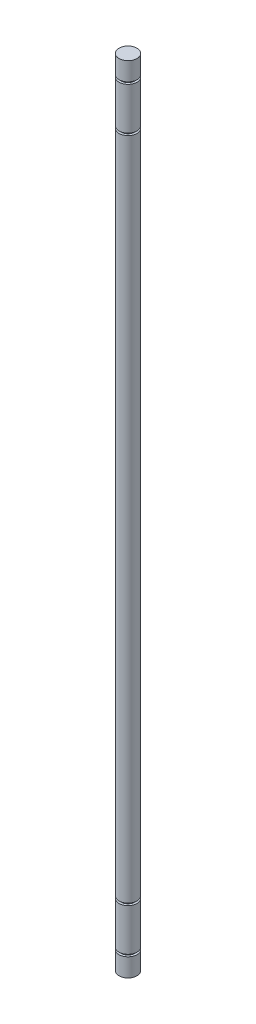
ISO-10303-21;
HEADER;
FILE_DESCRIPTION(('STEP AP214'),'2;1');
FILE_NAME('part.step','',(''),(''),'','','');
FILE_SCHEMA(('AUTOMOTIVE_DESIGN { 1 0 10303 214 1 1 1 1 }'));
ENDSEC;
DATA;
#1=APPLICATION_CONTEXT('core data for automotive mechanical design processes');
#2=APPLICATION_PROTOCOL_DEFINITION('international standard','automotive_design',2000,#1);
#3=PRODUCT_CONTEXT('',#1,'mechanical');
#4=PRODUCT('Part','Part','',(#3));
#5=PRODUCT_RELATED_PRODUCT_CATEGORY('part','',(#4));
#6=PRODUCT_DEFINITION_FORMATION('','',#4);
#7=PRODUCT_DEFINITION_CONTEXT('part definition',#1,'design');
#8=PRODUCT_DEFINITION('design','',#6,#7);
#9=PRODUCT_DEFINITION_SHAPE('','',#8);
#10=(LENGTH_UNIT() NAMED_UNIT(*) SI_UNIT(.MILLI.,.METRE.));
#11=(NAMED_UNIT(*) PLANE_ANGLE_UNIT() SI_UNIT($,.RADIAN.));
#12=(NAMED_UNIT(*) SI_UNIT($,.STERADIAN.) SOLID_ANGLE_UNIT());
#13=UNCERTAINTY_MEASURE_WITH_UNIT(LENGTH_MEASURE(1.E-05),#10,'distance_accuracy_value','');
#14=(GEOMETRIC_REPRESENTATION_CONTEXT(3) GLOBAL_UNCERTAINTY_ASSIGNED_CONTEXT((#13)) GLOBAL_UNIT_ASSIGNED_CONTEXT((#10,
#11,#12)) REPRESENTATION_CONTEXT('',''));
#15=CARTESIAN_POINT('',(0.,0.,0.));
#16=DIRECTION('',(0.,0.,1.));
#17=DIRECTION('',(1.,0.,0.));
#18=AXIS2_PLACEMENT_3D('',#15,#16,#17);
#19=CARTESIAN_POINT('',(0.,70.0659,0.));
#20=DIRECTION('',(0.,-1.,0.));
#21=DIRECTION('',(0.,0.,-1.));
#22=AXIS2_PLACEMENT_3D('',#19,#20,#21);
#23=CYLINDRICAL_SURFACE('',#22,1.5875);
#24=CARTESIAN_POINT('',(0.,-66.8274,0.));
#25=DIRECTION('',(0.,-1.,0.));
#26=DIRECTION('',(0.,0.,-1.));
#27=AXIS2_PLACEMENT_3D('',#24,#25,#26);
#28=CIRCLE('',#27,1.5875);
#29=CARTESIAN_POINT('',(0.,-66.8274,-1.5875));
#30=VERTEX_POINT('',#29);
#31=EDGE_CURVE('E65',#30,#30,#28,.T.);
#32=ORIENTED_EDGE('',*,*,#31,.T.);
#33=EDGE_LOOP('',(#32));
#34=FACE_BOUND('',#33,.T.);
#35=CARTESIAN_POINT('',(0.,-70.0659,0.));
#36=DIRECTION('',(0.,1.,0.));
#37=DIRECTION('',(0.,0.,1.));
#38=AXIS2_PLACEMENT_3D('',#35,#36,#37);
#39=CIRCLE('',#38,1.5875);
#40=CARTESIAN_POINT('',(0.,-70.0659,1.5875));
#41=VERTEX_POINT('',#40);
#42=EDGE_CURVE('E40',#41,#41,#39,.T.);
#43=ORIENTED_EDGE('',*,*,#42,.T.);
#44=EDGE_LOOP('',(#43));
#45=FACE_BOUND('',#44,.T.);
#46=ADVANCED_FACE('F36',(#34,#45),#23,.T.);
#47=CARTESIAN_POINT('',(0.,-70.0659,0.));
#48=DIRECTION('',(0.,1.,0.));
#49=DIRECTION('',(0.,0.,1.));
#50=AXIS2_PLACEMENT_3D('',#47,#48,#49);
#51=PLANE('',#50);
#52=ORIENTED_EDGE('',*,*,#42,.F.);
#53=EDGE_LOOP('',(#52));
#54=FACE_BOUND('',#53,.T.);
#55=ADVANCED_FACE('F144',(#54),#51,.F.);
#56=CARTESIAN_POINT('',(0.,-58.6232,0.));
#57=DIRECTION('',(0.,-1.,0.));
#58=DIRECTION('',(0.,0.,-1.));
#59=AXIS2_PLACEMENT_3D('',#56,#57,#58);
#60=CYLINDRICAL_SURFACE('',#59,1.2065);
#61=CARTESIAN_POINT('',(0.,-66.8274,0.));
#62=DIRECTION('',(0.,-1.,0.));
#63=DIRECTION('',(0.,0.,-1.));
#64=AXIS2_PLACEMENT_3D('',#61,#62,#63);
#65=CIRCLE('',#64,1.2065);
#66=CARTESIAN_POINT('',(0.,-66.8274,-1.2065));
#67=VERTEX_POINT('',#66);
#68=EDGE_CURVE('E61',#67,#67,#65,.T.);
#69=ORIENTED_EDGE('',*,*,#68,.F.);
#70=EDGE_LOOP('',(#69));
#71=FACE_BOUND('',#70,.T.);
#72=CARTESIAN_POINT('',(0.,-66.4464,0.));
#73=DIRECTION('',(0.,-1.,0.));
#74=DIRECTION('',(0.,0.,-1.));
#75=AXIS2_PLACEMENT_3D('',#72,#73,#74);
#76=CIRCLE('',#75,1.2065);
#77=CARTESIAN_POINT('',(0.,-66.4464,-1.2065));
#78=VERTEX_POINT('',#77);
#79=EDGE_CURVE('E71',#78,#78,#76,.T.);
#80=ORIENTED_EDGE('',*,*,#79,.T.);
#81=EDGE_LOOP('',(#80));
#82=FACE_BOUND('',#81,.T.);
#83=ADVANCED_FACE('F149',(#71,#82),#60,.T.);
#84=CARTESIAN_POINT('',(1.2065,-66.8274,0.));
#85=DIRECTION('',(0.,-1.,0.));
#86=DIRECTION('',(0.,0.,-1.));
#87=AXIS2_PLACEMENT_3D('',#84,#85,#86);
#88=PLANE('',#87);
#89=ORIENTED_EDGE('',*,*,#31,.F.);
#90=EDGE_LOOP('',(#89));
#91=FACE_BOUND('',#90,.T.);
#92=ORIENTED_EDGE('',*,*,#68,.T.);
#93=EDGE_LOOP('',(#92));
#94=FACE_BOUND('',#93,.T.);
#95=ADVANCED_FACE('F177',(#91,#94),#88,.F.);
#96=CARTESIAN_POINT('',(1.2065,-66.4464,0.));
#97=DIRECTION('',(0.,1.,0.));
#98=DIRECTION('',(0.,0.,1.));
#99=AXIS2_PLACEMENT_3D('',#96,#97,#98);
#100=PLANE('',#99);
#101=ORIENTED_EDGE('',*,*,#79,.F.);
#102=EDGE_LOOP('',(#101));
#103=FACE_BOUND('',#102,.T.);
#104=CARTESIAN_POINT('',(0.,-66.4464,0.));
#105=DIRECTION('',(0.,-1.,0.));
#106=DIRECTION('',(0.,0.,-1.));
#107=AXIS2_PLACEMENT_3D('',#104,#105,#106);
#108=CIRCLE('',#107,1.5875);
#109=CARTESIAN_POINT('',(0.,-66.4464,-1.5875));
#110=VERTEX_POINT('',#109);
#111=EDGE_CURVE('E68',#110,#110,#108,.T.);
#112=ORIENTED_EDGE('',*,*,#111,.T.);
#113=EDGE_LOOP('',(#112));
#114=FACE_BOUND('',#113,.T.);
#115=ADVANCED_FACE('F141',(#103,#114),#100,.F.);
#116=ORIENTED_EDGE('',*,*,#111,.F.);
#117=EDGE_LOOP('',(#116));
#118=FACE_BOUND('',#117,.T.);
#119=CARTESIAN_POINT('',(0.,-59.0042,0.));
#120=DIRECTION('',(0.,-1.,0.));
#121=DIRECTION('',(0.,0.,-1.));
#122=AXIS2_PLACEMENT_3D('',#119,#120,#121);
#123=CIRCLE('',#122,1.5875);
#124=CARTESIAN_POINT('',(0.,-59.0042,-1.5875));
#125=VERTEX_POINT('',#124);
#126=EDGE_CURVE('E88',#125,#125,#123,.T.);
#127=ORIENTED_EDGE('',*,*,#126,.T.);
#128=EDGE_LOOP('',(#127));
#129=FACE_BOUND('',#128,.T.);
#130=ADVANCED_FACE('F110',(#118,#129),#23,.T.);
#131=CARTESIAN_POINT('',(0.,-58.6232,0.));
#132=DIRECTION('',(0.,-1.,0.));
#133=DIRECTION('',(0.,0.,-1.));
#134=AXIS2_PLACEMENT_3D('',#131,#132,#133);
#135=CYLINDRICAL_SURFACE('',#134,1.2065);
#136=CARTESIAN_POINT('',(0.,-59.0042,0.));
#137=DIRECTION('',(0.,-1.,0.));
#138=DIRECTION('',(0.,0.,-1.));
#139=AXIS2_PLACEMENT_3D('',#136,#137,#138);
#140=CIRCLE('',#139,1.2065);
#141=CARTESIAN_POINT('',(0.,-59.0042,-1.2065));
#142=VERTEX_POINT('',#141);
#143=EDGE_CURVE('E60',#142,#142,#140,.T.);
#144=ORIENTED_EDGE('',*,*,#143,.F.);
#145=EDGE_LOOP('',(#144));
#146=FACE_BOUND('',#145,.T.);
#147=CARTESIAN_POINT('',(0.,-58.6232,0.));
#148=DIRECTION('',(0.,-1.,0.));
#149=DIRECTION('',(0.,0.,-1.));
#150=AXIS2_PLACEMENT_3D('',#147,#148,#149);
#151=CIRCLE('',#150,1.2065);
#152=CARTESIAN_POINT('',(0.,-58.6232,-1.2065));
#153=VERTEX_POINT('',#152);
#154=EDGE_CURVE('E77',#153,#153,#151,.T.);
#155=ORIENTED_EDGE('',*,*,#154,.T.);
#156=EDGE_LOOP('',(#155));
#157=FACE_BOUND('',#156,.T.);
#158=ADVANCED_FACE('F97',(#146,#157),#135,.T.);
#159=CARTESIAN_POINT('',(1.2065,-59.0042,0.));
#160=DIRECTION('',(0.,-1.,0.));
#161=DIRECTION('',(0.,0.,-1.));
#162=AXIS2_PLACEMENT_3D('',#159,#160,#161);
#163=PLANE('',#162);
#164=ORIENTED_EDGE('',*,*,#126,.F.);
#165=EDGE_LOOP('',(#164));
#166=FACE_BOUND('',#165,.T.);
#167=ORIENTED_EDGE('',*,*,#143,.T.);
#168=EDGE_LOOP('',(#167));
#169=FACE_BOUND('',#168,.T.);
#170=ADVANCED_FACE('F103',(#166,#169),#163,.F.);
#171=CARTESIAN_POINT('',(1.2065,-58.6232,0.));
#172=DIRECTION('',(0.,1.,0.));
#173=DIRECTION('',(0.,0.,1.));
#174=AXIS2_PLACEMENT_3D('',#171,#172,#173);
#175=PLANE('',#174);
#176=ORIENTED_EDGE('',*,*,#154,.F.);
#177=EDGE_LOOP('',(#176));
#178=FACE_BOUND('',#177,.T.);
#179=CARTESIAN_POINT('',(0.,-58.6232,0.));
#180=DIRECTION('',(0.,-1.,0.));
#181=DIRECTION('',(0.,0.,-1.));
#182=AXIS2_PLACEMENT_3D('',#179,#180,#181);
#183=CIRCLE('',#182,1.5875);
#184=CARTESIAN_POINT('',(0.,-58.6232,-1.5875));
#185=VERTEX_POINT('',#184);
#186=EDGE_CURVE('E91',#185,#185,#183,.T.);
#187=ORIENTED_EDGE('',*,*,#186,.T.);
#188=EDGE_LOOP('',(#187));
#189=FACE_BOUND('',#188,.T.);
#190=ADVANCED_FACE('F99',(#178,#189),#175,.F.);
#191=ORIENTED_EDGE('',*,*,#186,.F.);
#192=EDGE_LOOP('',(#191));
#193=FACE_BOUND('',#192,.T.);
#194=CARTESIAN_POINT('',(0.,58.6232,0.));
#195=DIRECTION('',(0.,-1.,0.));
#196=DIRECTION('',(0.,0.,-1.));
#197=AXIS2_PLACEMENT_3D('',#194,#195,#196);
#198=CIRCLE('',#197,1.5875);
#199=CARTESIAN_POINT('',(0.,58.6232,-1.5875));
#200=VERTEX_POINT('',#199);
#201=EDGE_CURVE('E51',#200,#200,#198,.T.);
#202=ORIENTED_EDGE('',*,*,#201,.T.);
#203=EDGE_LOOP('',(#202));
#204=FACE_BOUND('',#203,.T.);
#205=ADVANCED_FACE('F102',(#193,#204),#23,.T.);
#206=CARTESIAN_POINT('',(0.,-58.6232,0.));
#207=DIRECTION('',(0.,-1.,0.));
#208=DIRECTION('',(0.,0.,-1.));
#209=AXIS2_PLACEMENT_3D('',#206,#207,#208);
#210=CYLINDRICAL_SURFACE('',#209,1.20649999999999);
#211=CARTESIAN_POINT('',(0.,58.6232,0.));
#212=DIRECTION('',(0.,-1.,0.));
#213=DIRECTION('',(0.,0.,-1.));
#214=AXIS2_PLACEMENT_3D('',#211,#212,#213);
#215=CIRCLE('',#214,1.20649999999999);
#216=CARTESIAN_POINT('',(0.,58.6232,-1.20649999999999));
#217=VERTEX_POINT('',#216);
#218=EDGE_CURVE('E47',#217,#217,#215,.T.);
#219=ORIENTED_EDGE('',*,*,#218,.F.);
#220=EDGE_LOOP('',(#219));
#221=FACE_BOUND('',#220,.T.);
#222=CARTESIAN_POINT('',(0.,59.0042,0.));
#223=DIRECTION('',(0.,-1.,0.));
#224=DIRECTION('',(0.,0.,-1.));
#225=AXIS2_PLACEMENT_3D('',#222,#223,#224);
#226=CIRCLE('',#225,1.20649999999999);
#227=CARTESIAN_POINT('',(0.,59.0042,-1.20649999999999));
#228=VERTEX_POINT('',#227);
#229=EDGE_CURVE('E57',#228,#228,#226,.T.);
#230=ORIENTED_EDGE('',*,*,#229,.T.);
#231=EDGE_LOOP('',(#230));
#232=FACE_BOUND('',#231,.T.);
#233=ADVANCED_FACE('F109',(#221,#232),#210,.T.);
#234=CARTESIAN_POINT('',(1.20649999999999,58.6232,0.));
#235=DIRECTION('',(0.,-1.,0.));
#236=DIRECTION('',(0.,0.,-1.));
#237=AXIS2_PLACEMENT_3D('',#234,#235,#236);
#238=PLANE('',#237);
#239=ORIENTED_EDGE('',*,*,#201,.F.);
#240=EDGE_LOOP('',(#239));
#241=FACE_BOUND('',#240,.T.);
#242=ORIENTED_EDGE('',*,*,#218,.T.);
#243=EDGE_LOOP('',(#242));
#244=FACE_BOUND('',#243,.T.);
#245=ADVANCED_FACE('F113',(#241,#244),#238,.F.);
#246=CARTESIAN_POINT('',(1.20649999999999,59.0042,0.));
#247=DIRECTION('',(0.,1.,0.));
#248=DIRECTION('',(0.,0.,1.));
#249=AXIS2_PLACEMENT_3D('',#246,#247,#248);
#250=PLANE('',#249);
#251=ORIENTED_EDGE('',*,*,#229,.F.);
#252=EDGE_LOOP('',(#251));
#253=FACE_BOUND('',#252,.T.);
#254=CARTESIAN_POINT('',(0.,59.0042,0.));
#255=DIRECTION('',(0.,-1.,0.));
#256=DIRECTION('',(0.,0.,-1.));
#257=AXIS2_PLACEMENT_3D('',#254,#255,#256);
#258=CIRCLE('',#257,1.5875);
#259=CARTESIAN_POINT('',(0.,59.0042,-1.5875));
#260=VERTEX_POINT('',#259);
#261=EDGE_CURVE('E54',#260,#260,#258,.T.);
#262=ORIENTED_EDGE('',*,*,#261,.T.);
#263=EDGE_LOOP('',(#262));
#264=FACE_BOUND('',#263,.T.);
#265=ADVANCED_FACE('F116',(#253,#264),#250,.F.);
#266=CARTESIAN_POINT('',(0.,66.4464,0.));
#267=DIRECTION('',(0.,-1.,0.));
#268=DIRECTION('',(0.,0.,-1.));
#269=AXIS2_PLACEMENT_3D('',#266,#267,#268);
#270=CIRCLE('',#269,1.5875);
#271=CARTESIAN_POINT('',(0.,66.4464,-1.5875));
#272=VERTEX_POINT('',#271);
#273=EDGE_CURVE('E78',#272,#272,#270,.T.);
#274=ORIENTED_EDGE('',*,*,#273,.T.);
#275=EDGE_LOOP('',(#274));
#276=FACE_BOUND('',#275,.T.);
#277=ORIENTED_EDGE('',*,*,#261,.F.);
#278=EDGE_LOOP('',(#277));
#279=FACE_BOUND('',#278,.T.);
#280=ADVANCED_FACE('F127',(#276,#279),#23,.T.);
#281=CARTESIAN_POINT('',(0.,-58.6232,0.));
#282=DIRECTION('',(0.,-1.,0.));
#283=DIRECTION('',(0.,0.,-1.));
#284=AXIS2_PLACEMENT_3D('',#281,#282,#283);
#285=CYLINDRICAL_SURFACE('',#284,1.20649999999998);
#286=CARTESIAN_POINT('',(0.,66.4464,0.));
#287=DIRECTION('',(0.,-1.,0.));
#288=DIRECTION('',(0.,0.,-1.));
#289=AXIS2_PLACEMENT_3D('',#286,#287,#288);
#290=CIRCLE('',#289,1.20649999999998);
#291=CARTESIAN_POINT('',(0.,66.4464,-1.20649999999998));
#292=VERTEX_POINT('',#291);
#293=EDGE_CURVE('E74',#292,#292,#290,.T.);
#294=ORIENTED_EDGE('',*,*,#293,.F.);
#295=EDGE_LOOP('',(#294));
#296=FACE_BOUND('',#295,.T.);
#297=CARTESIAN_POINT('',(0.,66.8274,0.));
#298=DIRECTION('',(0.,-1.,0.));
#299=DIRECTION('',(0.,0.,-1.));
#300=AXIS2_PLACEMENT_3D('',#297,#298,#299);
#301=CIRCLE('',#300,1.20649999999998);
#302=CARTESIAN_POINT('',(0.,66.8274,-1.20649999999998));
#303=VERTEX_POINT('',#302);
#304=EDGE_CURVE('E64',#303,#303,#301,.T.);
#305=ORIENTED_EDGE('',*,*,#304,.T.);
#306=EDGE_LOOP('',(#305));
#307=FACE_BOUND('',#306,.T.);
#308=ADVANCED_FACE('F132',(#296,#307),#285,.T.);
#309=CARTESIAN_POINT('',(1.20649999999998,66.4464,0.));
#310=DIRECTION('',(0.,-1.,0.));
#311=DIRECTION('',(0.,0.,-1.));
#312=AXIS2_PLACEMENT_3D('',#309,#310,#311);
#313=PLANE('',#312);
#314=ORIENTED_EDGE('',*,*,#273,.F.);
#315=EDGE_LOOP('',(#314));
#316=FACE_BOUND('',#315,.T.);
#317=ORIENTED_EDGE('',*,*,#293,.T.);
#318=EDGE_LOOP('',(#317));
#319=FACE_BOUND('',#318,.T.);
#320=ADVANCED_FACE('F137',(#316,#319),#313,.F.);
#321=CARTESIAN_POINT('',(1.20649999999998,66.8274,0.));
#322=DIRECTION('',(0.,1.,0.));
#323=DIRECTION('',(0.,0.,1.));
#324=AXIS2_PLACEMENT_3D('',#321,#322,#323);
#325=PLANE('',#324);
#326=ORIENTED_EDGE('',*,*,#304,.F.);
#327=EDGE_LOOP('',(#326));
#328=FACE_BOUND('',#327,.T.);
#329=CARTESIAN_POINT('',(0.,66.8274,0.));
#330=DIRECTION('',(0.,-1.,0.));
#331=DIRECTION('',(0.,0.,-1.));
#332=AXIS2_PLACEMENT_3D('',#329,#330,#331);
#333=CIRCLE('',#332,1.5875);
#334=CARTESIAN_POINT('',(0.,66.8274,-1.5875));
#335=VERTEX_POINT('',#334);
#336=EDGE_CURVE('E81',#335,#335,#333,.T.);
#337=ORIENTED_EDGE('',*,*,#336,.T.);
#338=EDGE_LOOP('',(#337));
#339=FACE_BOUND('',#338,.T.);
#340=ADVANCED_FACE('F158',(#328,#339),#325,.F.);
#341=CARTESIAN_POINT('',(0.,70.0659,0.));
#342=DIRECTION('',(0.,1.,0.));
#343=DIRECTION('',(0.,0.,1.));
#344=AXIS2_PLACEMENT_3D('',#341,#342,#343);
#345=PLANE('',#344);
#346=CARTESIAN_POINT('',(0.,70.0659,0.));
#347=DIRECTION('',(0.,1.,0.));
#348=DIRECTION('',(0.,0.,1.));
#349=AXIS2_PLACEMENT_3D('',#346,#347,#348);
#350=CIRCLE('',#349,1.5875);
#351=CARTESIAN_POINT('',(0.,70.0659,1.5875));
#352=VERTEX_POINT('',#351);
#353=EDGE_CURVE('E10',#352,#352,#350,.T.);
#354=ORIENTED_EDGE('',*,*,#353,.T.);
#355=EDGE_LOOP('',(#354));
#356=FACE_BOUND('',#355,.T.);
#357=ADVANCED_FACE('F153',(#356),#345,.T.);
#358=ORIENTED_EDGE('',*,*,#336,.F.);
#359=EDGE_LOOP('',(#358));
#360=FACE_BOUND('',#359,.T.);
#361=ORIENTED_EDGE('',*,*,#353,.F.);
#362=EDGE_LOOP('',(#361));
#363=FACE_BOUND('',#362,.T.);
#364=ADVANCED_FACE('F38',(#360,#363),#23,.T.);
#365=CLOSED_SHELL('',(#46,#55,#83,#95,#115,#130,#158,#170,#190,#205,#233,#245,#265,#280,#308,
#320,#340,#357,#364));
#366=MANIFOLD_SOLID_BREP('B2',#365);
#367=ADVANCED_BREP_SHAPE_REPRESENTATION('',(#18,#366),#14);
#368=SHAPE_DEFINITION_REPRESENTATION(#9,#367);
ENDSEC;
END-ISO-10303-21;
